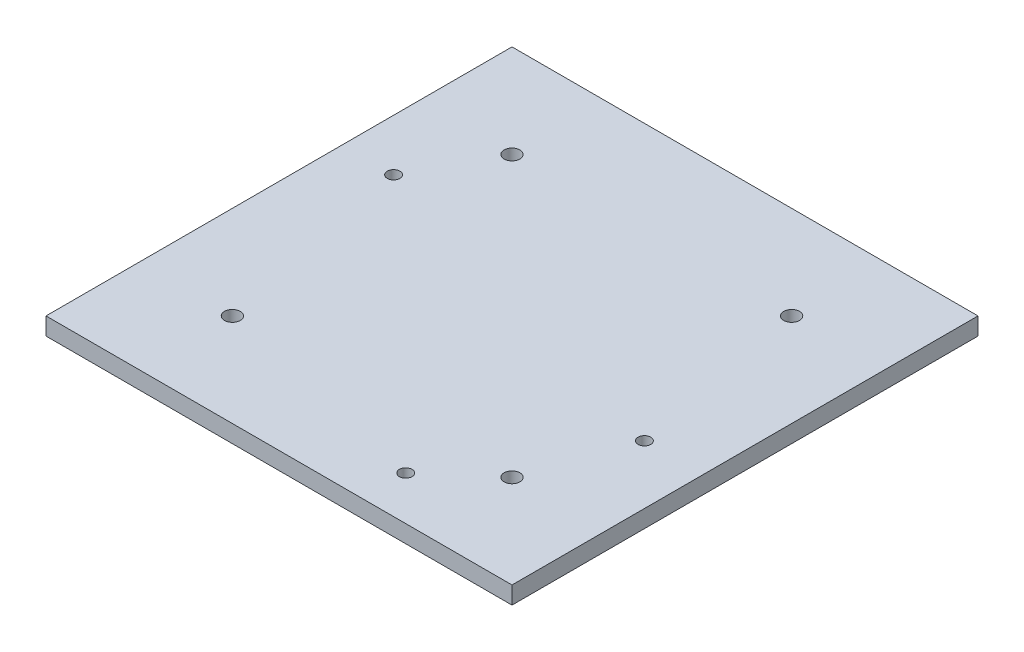
ISO-10303-21;
HEADER;
FILE_DESCRIPTION(('STEP AP214'),'2;1');
FILE_NAME('part.step','',(''),(''),'','','');
FILE_SCHEMA(('AUTOMOTIVE_DESIGN { 1 0 10303 214 1 1 1 1 }'));
ENDSEC;
DATA;
#1=APPLICATION_CONTEXT('core data for automotive mechanical design processes');
#2=APPLICATION_PROTOCOL_DEFINITION('international standard','automotive_design',2000,#1);
#3=PRODUCT_CONTEXT('',#1,'mechanical');
#4=PRODUCT('Part','Part','',(#3));
#5=PRODUCT_RELATED_PRODUCT_CATEGORY('part','',(#4));
#6=PRODUCT_DEFINITION_FORMATION('','',#4);
#7=PRODUCT_DEFINITION_CONTEXT('part definition',#1,'design');
#8=PRODUCT_DEFINITION('design','',#6,#7);
#9=PRODUCT_DEFINITION_SHAPE('','',#8);
#10=(LENGTH_UNIT() NAMED_UNIT(*) SI_UNIT(.MILLI.,.METRE.));
#11=(NAMED_UNIT(*) PLANE_ANGLE_UNIT() SI_UNIT($,.RADIAN.));
#12=(NAMED_UNIT(*) SI_UNIT($,.STERADIAN.) SOLID_ANGLE_UNIT());
#13=UNCERTAINTY_MEASURE_WITH_UNIT(LENGTH_MEASURE(1.E-05),#10,'distance_accuracy_value','');
#14=(GEOMETRIC_REPRESENTATION_CONTEXT(3) GLOBAL_UNCERTAINTY_ASSIGNED_CONTEXT((#13)) GLOBAL_UNIT_ASSIGNED_CONTEXT((#10,
#11,#12)) REPRESENTATION_CONTEXT('',''));
#15=CARTESIAN_POINT('',(0.,0.,0.));
#16=DIRECTION('',(0.,0.,1.));
#17=DIRECTION('',(1.,0.,0.));
#18=AXIS2_PLACEMENT_3D('',#15,#16,#17);
#19=CARTESIAN_POINT('',(0.,4.7625,0.));
#20=DIRECTION('',(0.,1.,0.));
#21=DIRECTION('',(0.,0.,1.));
#22=AXIS2_PLACEMENT_3D('',#19,#20,#21);
#23=PLANE('',#22);
#24=CARTESIAN_POINT('',(-80.9364921297783,4.7625,-54.7767676767677));
#25=DIRECTION('',(0.,-1.,0.));
#26=DIRECTION('',(0.,0.,-1.));
#27=AXIS2_PLACEMENT_3D('',#24,#25,#26);
#28=CIRCLE('',#27,2.15264999999999);
#29=CARTESIAN_POINT('',(-80.9364921297783,4.7625,-56.9294176767677));
#30=VERTEX_POINT('',#29);
#31=EDGE_CURVE('E130',#30,#30,#28,.T.);
#32=ORIENTED_EDGE('',*,*,#31,.T.);
#33=EDGE_LOOP('',(#32));
#34=FACE_BOUND('',#33,.T.);
#35=DIRECTION('',(0.,0.,-1.));
#36=VECTOR('',#35,1.);
#37=CARTESIAN_POINT('',(20.6635078702217,4.7625,-80.1767676767677));
#38=LINE('',#37,#36);
#39=CARTESIAN_POINT('',(20.6635078702217,4.7625,46.8232323232323));
#40=VERTEX_POINT('',#39);
#41=CARTESIAN_POINT('',(20.6635078702217,4.7625,-80.1767676767677));
#42=VERTEX_POINT('',#41);
#43=EDGE_CURVE('E92',#40,#42,#38,.T.);
#44=ORIENTED_EDGE('',*,*,#43,.T.);
#45=DIRECTION('',(-1.,0.,0.));
#46=VECTOR('',#45,1.);
#47=CARTESIAN_POINT('',(-106.336492129778,4.7625,-80.1767676767677));
#48=LINE('',#47,#46);
#49=CARTESIAN_POINT('',(-106.336492129778,4.7625,-80.1767676767677));
#50=VERTEX_POINT('',#49);
#51=EDGE_CURVE('E87',#42,#50,#48,.T.);
#52=ORIENTED_EDGE('',*,*,#51,.T.);
#53=DIRECTION('',(0.,0.,1.));
#54=VECTOR('',#53,1.);
#55=CARTESIAN_POINT('',(-106.336492129778,4.7625,-80.1767676767677));
#56=LINE('',#55,#54);
#57=CARTESIAN_POINT('',(-106.336492129778,4.7625,46.8232323232323));
#58=VERTEX_POINT('',#57);
#59=EDGE_CURVE('E90',#50,#58,#56,.T.);
#60=ORIENTED_EDGE('',*,*,#59,.T.);
#61=DIRECTION('',(1.,0.,0.));
#62=VECTOR('',#61,1.);
#63=CARTESIAN_POINT('',(-106.336492129778,4.7625,46.8232323232323));
#64=LINE('',#63,#62);
#65=EDGE_CURVE('E57',#58,#40,#64,.T.);
#66=ORIENTED_EDGE('',*,*,#65,.T.);
#67=EDGE_LOOP('',(#44,#52,#60,#66));
#68=FACE_BOUND('',#67,.T.);
#69=CARTESIAN_POINT('',(-92.2813444725521,4.7625,-33.8500482514238));
#70=DIRECTION('',(0.,1.,0.));
#71=DIRECTION('',(0.,0.,1.));
#72=AXIS2_PLACEMENT_3D('',#69,#70,#71);
#73=CIRCLE('',#72,1.7272);
#74=CARTESIAN_POINT('',(-92.2813444725521,4.7625,-32.1228482514238));
#75=VERTEX_POINT('',#74);
#76=EDGE_CURVE('E119',#75,#75,#73,.T.);
#77=ORIENTED_EDGE('',*,*,#76,.F.);
#78=EDGE_LOOP('',(#77));
#79=FACE_BOUND('',#78,.T.);
#80=CARTESIAN_POINT('',(-20.243685743917,4.7625,34.8839487871358));
#81=DIRECTION('',(0.,1.,0.));
#82=DIRECTION('',(0.,0.,1.));
#83=AXIS2_PLACEMENT_3D('',#80,#81,#82);
#84=CIRCLE('',#83,1.7272);
#85=CARTESIAN_POINT('',(-20.243685743917,4.7625,36.6111487871358));
#86=VERTEX_POINT('',#85);
#87=EDGE_CURVE('E161',#86,#86,#84,.T.);
#88=ORIENTED_EDGE('',*,*,#87,.F.);
#89=EDGE_LOOP('',(#88));
#90=FACE_BOUND('',#89,.T.);
#91=CARTESIAN_POINT('',(4.68077748384013,4.7625,-5.25040892303801));
#92=DIRECTION('',(0.,1.,0.));
#93=DIRECTION('',(0.,0.,1.));
#94=AXIS2_PLACEMENT_3D('',#91,#92,#93);
#95=CIRCLE('',#94,1.7272);
#96=CARTESIAN_POINT('',(4.68077748384013,4.7625,-3.52320892303801));
#97=VERTEX_POINT('',#96);
#98=EDGE_CURVE('E163',#97,#97,#95,.T.);
#99=ORIENTED_EDGE('',*,*,#98,.F.);
#100=EDGE_LOOP('',(#99));
#101=FACE_BOUND('',#100,.T.);
#102=CARTESIAN_POINT('',(-80.9364921297783,4.7625,21.4232323232323));
#103=DIRECTION('',(0.,-1.,0.));
#104=DIRECTION('',(0.,0.,-1.));
#105=AXIS2_PLACEMENT_3D('',#102,#103,#104);
#106=CIRCLE('',#105,2.15264999999999);
#107=CARTESIAN_POINT('',(-80.9364921297783,4.7625,19.2705823232323));
#108=VERTEX_POINT('',#107);
#109=EDGE_CURVE('E156',#108,#108,#106,.T.);
#110=ORIENTED_EDGE('',*,*,#109,.T.);
#111=EDGE_LOOP('',(#110));
#112=FACE_BOUND('',#111,.T.);
#113=CARTESIAN_POINT('',(-4.73649212977831,4.7625,-54.7767676767677));
#114=DIRECTION('',(0.,-1.,0.));
#115=DIRECTION('',(0.,0.,-1.));
#116=AXIS2_PLACEMENT_3D('',#113,#114,#115);
#117=CIRCLE('',#116,2.15265);
#118=CARTESIAN_POINT('',(-4.73649212977831,4.7625,-56.9294176767677));
#119=VERTEX_POINT('',#118);
#120=EDGE_CURVE('E147',#119,#119,#117,.T.);
#121=ORIENTED_EDGE('',*,*,#120,.T.);
#122=EDGE_LOOP('',(#121));
#123=FACE_BOUND('',#122,.T.);
#124=CARTESIAN_POINT('',(-4.73649212977831,4.7625,21.4232323232323));
#125=DIRECTION('',(0.,-1.,0.));
#126=DIRECTION('',(0.,0.,-1.));
#127=AXIS2_PLACEMENT_3D('',#124,#125,#126);
#128=CIRCLE('',#127,2.15265);
#129=CARTESIAN_POINT('',(-4.73649212977831,4.7625,19.2705823232323));
#130=VERTEX_POINT('',#129);
#131=EDGE_CURVE('E139',#130,#130,#128,.T.);
#132=ORIENTED_EDGE('',*,*,#131,.T.);
#133=EDGE_LOOP('',(#132));
#134=FACE_BOUND('',#133,.T.);
#135=ADVANCED_FACE('F40',(#34,#68,#79,#90,#101,#112,#123,#134),#23,.T.);
#136=CARTESIAN_POINT('',(20.6635078702217,4.7625,-80.1767676767677));
#137=DIRECTION('',(-1.,0.,0.));
#138=DIRECTION('',(0.,0.,1.));
#139=AXIS2_PLACEMENT_3D('',#136,#137,#138);
#140=PLANE('',#139);
#141=DIRECTION('',(0.,0.,-1.));
#142=VECTOR('',#141,1.);
#143=CARTESIAN_POINT('',(20.6635078702217,0.,-80.1767676767677));
#144=LINE('',#143,#142);
#145=CARTESIAN_POINT('',(20.6635078702217,0.,46.8232323232323));
#146=VERTEX_POINT('',#145);
#147=CARTESIAN_POINT('',(20.6635078702217,0.,-80.1767676767677));
#148=VERTEX_POINT('',#147);
#149=EDGE_CURVE('E218',#146,#148,#144,.T.);
#150=ORIENTED_EDGE('',*,*,#149,.T.);
#151=DIRECTION('',(0.,-1.,0.));
#152=VECTOR('',#151,1.);
#153=CARTESIAN_POINT('',(20.6635078702217,4.7625,-80.1767676767677));
#154=LINE('',#153,#152);
#155=EDGE_CURVE('E12',#42,#148,#154,.T.);
#156=ORIENTED_EDGE('',*,*,#155,.F.);
#157=ORIENTED_EDGE('',*,*,#43,.F.);
#158=DIRECTION('',(0.,-1.,0.));
#159=VECTOR('',#158,1.);
#160=CARTESIAN_POINT('',(20.6635078702217,4.7625,46.8232323232323));
#161=LINE('',#160,#159);
#162=EDGE_CURVE('E103',#40,#146,#161,.T.);
#163=ORIENTED_EDGE('',*,*,#162,.T.);
#164=EDGE_LOOP('',(#150,#156,#157,#163));
#165=FACE_BOUND('',#164,.T.);
#166=ADVANCED_FACE('F42',(#165),#140,.F.);
#167=CARTESIAN_POINT('',(-106.336492129778,4.7625,-80.1767676767677));
#168=DIRECTION('',(0.,0.,1.));
#169=DIRECTION('',(1.,0.,0.));
#170=AXIS2_PLACEMENT_3D('',#167,#168,#169);
#171=PLANE('',#170);
#172=DIRECTION('',(-1.,0.,0.));
#173=VECTOR('',#172,1.);
#174=CARTESIAN_POINT('',(-106.336492129778,0.,-80.1767676767677));
#175=LINE('',#174,#173);
#176=CARTESIAN_POINT('',(-106.336492129778,0.,-80.1767676767677));
#177=VERTEX_POINT('',#176);
#178=EDGE_CURVE('E97',#148,#177,#175,.T.);
#179=ORIENTED_EDGE('',*,*,#178,.T.);
#180=DIRECTION('',(0.,-1.,0.));
#181=VECTOR('',#180,1.);
#182=CARTESIAN_POINT('',(-106.336492129778,4.7625,-80.1767676767677));
#183=LINE('',#182,#181);
#184=EDGE_CURVE('E49',#50,#177,#183,.T.);
#185=ORIENTED_EDGE('',*,*,#184,.F.);
#186=ORIENTED_EDGE('',*,*,#51,.F.);
#187=ORIENTED_EDGE('',*,*,#155,.T.);
#188=EDGE_LOOP('',(#179,#185,#186,#187));
#189=FACE_BOUND('',#188,.T.);
#190=ADVANCED_FACE('F96',(#189),#171,.F.);
#191=CARTESIAN_POINT('',(-106.336492129778,4.7625,-80.1767676767677));
#192=DIRECTION('',(1.,0.,0.));
#193=DIRECTION('',(0.,0.,-1.));
#194=AXIS2_PLACEMENT_3D('',#191,#192,#193);
#195=PLANE('',#194);
#196=DIRECTION('',(0.,0.,1.));
#197=VECTOR('',#196,1.);
#198=CARTESIAN_POINT('',(-106.336492129778,0.,-80.1767676767677));
#199=LINE('',#198,#197);
#200=CARTESIAN_POINT('',(-106.336492129778,0.,46.8232323232323));
#201=VERTEX_POINT('',#200);
#202=EDGE_CURVE('E74',#177,#201,#199,.T.);
#203=ORIENTED_EDGE('',*,*,#202,.T.);
#204=DIRECTION('',(0.,-1.,0.));
#205=VECTOR('',#204,1.);
#206=CARTESIAN_POINT('',(-106.336492129778,4.7625,46.8232323232323));
#207=LINE('',#206,#205);
#208=EDGE_CURVE('E98',#58,#201,#207,.T.);
#209=ORIENTED_EDGE('',*,*,#208,.F.);
#210=ORIENTED_EDGE('',*,*,#59,.F.);
#211=ORIENTED_EDGE('',*,*,#184,.T.);
#212=EDGE_LOOP('',(#203,#209,#210,#211));
#213=FACE_BOUND('',#212,.T.);
#214=ADVANCED_FACE('F99',(#213),#195,.F.);
#215=CARTESIAN_POINT('',(-106.336492129778,4.7625,46.8232323232323));
#216=DIRECTION('',(0.,0.,-1.));
#217=DIRECTION('',(-1.,0.,0.));
#218=AXIS2_PLACEMENT_3D('',#215,#216,#217);
#219=PLANE('',#218);
#220=DIRECTION('',(1.,0.,0.));
#221=VECTOR('',#220,1.);
#222=CARTESIAN_POINT('',(-106.336492129778,0.,46.8232323232323));
#223=LINE('',#222,#221);
#224=EDGE_CURVE('E80',#201,#146,#223,.T.);
#225=ORIENTED_EDGE('',*,*,#224,.T.);
#226=ORIENTED_EDGE('',*,*,#162,.F.);
#227=ORIENTED_EDGE('',*,*,#65,.F.);
#228=ORIENTED_EDGE('',*,*,#208,.T.);
#229=EDGE_LOOP('',(#225,#226,#227,#228));
#230=FACE_BOUND('',#229,.T.);
#231=ADVANCED_FACE('F201',(#230),#219,.F.);
#232=CARTESIAN_POINT('',(0.,0.,0.));
#233=DIRECTION('',(0.,1.,0.));
#234=DIRECTION('',(0.,0.,1.));
#235=AXIS2_PLACEMENT_3D('',#232,#233,#234);
#236=PLANE('',#235);
#237=CARTESIAN_POINT('',(-80.9364921297783,0.,-54.7767676767677));
#238=DIRECTION('',(0.,-1.,0.));
#239=DIRECTION('',(0.,0.,-1.));
#240=AXIS2_PLACEMENT_3D('',#237,#238,#239);
#241=CIRCLE('',#240,2.15265000000001);
#242=CARTESIAN_POINT('',(-80.9364921297783,0.,-56.9294176767677));
#243=VERTEX_POINT('',#242);
#244=EDGE_CURVE('E137',#243,#243,#241,.T.);
#245=ORIENTED_EDGE('',*,*,#244,.F.);
#246=EDGE_LOOP('',(#245));
#247=FACE_BOUND('',#246,.T.);
#248=CARTESIAN_POINT('',(-4.73649212977831,0.,21.4232323232323));
#249=DIRECTION('',(0.,-1.,0.));
#250=DIRECTION('',(0.,0.,-1.));
#251=AXIS2_PLACEMENT_3D('',#248,#249,#250);
#252=CIRCLE('',#251,2.15265);
#253=CARTESIAN_POINT('',(-4.73649212977831,0.,19.2705823232323));
#254=VERTEX_POINT('',#253);
#255=EDGE_CURVE('E136',#254,#254,#252,.T.);
#256=ORIENTED_EDGE('',*,*,#255,.F.);
#257=EDGE_LOOP('',(#256));
#258=FACE_BOUND('',#257,.T.);
#259=CARTESIAN_POINT('',(-4.73649212977831,0.,-54.7767676767677));
#260=DIRECTION('',(0.,-1.,0.));
#261=DIRECTION('',(0.,0.,-1.));
#262=AXIS2_PLACEMENT_3D('',#259,#260,#261);
#263=CIRCLE('',#262,2.15265);
#264=CARTESIAN_POINT('',(-4.73649212977831,0.,-56.9294176767677));
#265=VERTEX_POINT('',#264);
#266=EDGE_CURVE('E144',#265,#265,#263,.T.);
#267=ORIENTED_EDGE('',*,*,#266,.F.);
#268=EDGE_LOOP('',(#267));
#269=FACE_BOUND('',#268,.T.);
#270=CARTESIAN_POINT('',(-80.9364921297783,0.,21.4232323232323));
#271=DIRECTION('',(0.,-1.,0.));
#272=DIRECTION('',(0.,0.,-1.));
#273=AXIS2_PLACEMENT_3D('',#270,#271,#272);
#274=CIRCLE('',#273,2.15265000000001);
#275=CARTESIAN_POINT('',(-80.9364921297783,0.,19.2705823232323));
#276=VERTEX_POINT('',#275);
#277=EDGE_CURVE('E152',#276,#276,#274,.T.);
#278=ORIENTED_EDGE('',*,*,#277,.F.);
#279=EDGE_LOOP('',(#278));
#280=FACE_BOUND('',#279,.T.);
#281=CARTESIAN_POINT('',(4.68077748384013,0.,-5.25040892303801));
#282=DIRECTION('',(0.,1.,0.));
#283=DIRECTION('',(0.,0.,1.));
#284=AXIS2_PLACEMENT_3D('',#281,#282,#283);
#285=CIRCLE('',#284,1.7272);
#286=CARTESIAN_POINT('',(4.68077748384013,0.,-3.52320892303801));
#287=VERTEX_POINT('',#286);
#288=EDGE_CURVE('E125',#287,#287,#285,.T.);
#289=ORIENTED_EDGE('',*,*,#288,.T.);
#290=EDGE_LOOP('',(#289));
#291=FACE_BOUND('',#290,.T.);
#292=CARTESIAN_POINT('',(-20.243685743917,0.,34.8839487871358));
#293=DIRECTION('',(0.,1.,0.));
#294=DIRECTION('',(0.,0.,1.));
#295=AXIS2_PLACEMENT_3D('',#292,#293,#294);
#296=CIRCLE('',#295,1.7272);
#297=CARTESIAN_POINT('',(-20.243685743917,0.,36.6111487871358));
#298=VERTEX_POINT('',#297);
#299=EDGE_CURVE('E168',#298,#298,#296,.T.);
#300=ORIENTED_EDGE('',*,*,#299,.T.);
#301=EDGE_LOOP('',(#300));
#302=FACE_BOUND('',#301,.T.);
#303=CARTESIAN_POINT('',(-92.2813444725521,0.,-33.8500482514238));
#304=DIRECTION('',(0.,1.,0.));
#305=DIRECTION('',(0.,0.,1.));
#306=AXIS2_PLACEMENT_3D('',#303,#304,#305);
#307=CIRCLE('',#306,1.7272);
#308=CARTESIAN_POINT('',(-92.2813444725521,0.,-32.1228482514238));
#309=VERTEX_POINT('',#308);
#310=EDGE_CURVE('E124',#309,#309,#307,.T.);
#311=ORIENTED_EDGE('',*,*,#310,.T.);
#312=EDGE_LOOP('',(#311));
#313=FACE_BOUND('',#312,.T.);
#314=ORIENTED_EDGE('',*,*,#149,.F.);
#315=ORIENTED_EDGE('',*,*,#224,.F.);
#316=ORIENTED_EDGE('',*,*,#202,.F.);
#317=ORIENTED_EDGE('',*,*,#178,.F.);
#318=EDGE_LOOP('',(#314,#315,#316,#317));
#319=FACE_BOUND('',#318,.T.);
#320=ADVANCED_FACE('F197',(#247,#258,#269,#280,#291,#302,#313,#319),#236,.F.);
#321=CARTESIAN_POINT('',(-92.2813444725521,0.,-33.8500482514238));
#322=DIRECTION('',(0.,1.,0.));
#323=DIRECTION('',(0.,0.,1.));
#324=AXIS2_PLACEMENT_3D('',#321,#322,#323);
#325=CYLINDRICAL_SURFACE('',#324,1.7272);
#326=CARTESIAN_POINT('',(-92.2813444725521,0.,-32.1228482514238));
#327=CARTESIAN_POINT('',(-92.2813444725521,0.049609375,-32.1228482514238));
#328=CARTESIAN_POINT('',(-92.2813444725521,0.09921875,-32.1228482514238));
#329=CARTESIAN_POINT('',(-92.2813444725521,0.1984375,-32.1228482514238));
#330=CARTESIAN_POINT('',(-92.2813444725521,0.248046875,-32.1228482514238));
#331=CARTESIAN_POINT('',(-92.2813444725521,0.347265625,-32.1228482514238));
#332=CARTESIAN_POINT('',(-92.2813444725521,0.396875,-32.1228482514238));
#333=CARTESIAN_POINT('',(-92.2813444725521,0.49609375,-32.1228482514238));
#334=CARTESIAN_POINT('',(-92.2813444725521,0.545703125,-32.1228482514238));
#335=CARTESIAN_POINT('',(-92.2813444725521,0.644921875,-32.1228482514238));
#336=CARTESIAN_POINT('',(-92.2813444725521,0.69453125,-32.1228482514238));
#337=CARTESIAN_POINT('',(-92.2813444725521,0.79375,-32.1228482514238));
#338=CARTESIAN_POINT('',(-92.2813444725521,0.843359375,-32.1228482514238));
#339=CARTESIAN_POINT('',(-92.2813444725521,0.942578125,-32.1228482514238));
#340=CARTESIAN_POINT('',(-92.2813444725521,0.9921875,-32.1228482514238));
#341=CARTESIAN_POINT('',(-92.2813444725521,1.09140625,-32.1228482514238));
#342=CARTESIAN_POINT('',(-92.2813444725521,1.141015625,-32.1228482514238));
#343=CARTESIAN_POINT('',(-92.2813444725521,1.240234375,-32.1228482514238));
#344=CARTESIAN_POINT('',(-92.2813444725521,1.28984375,-32.1228482514238));
#345=CARTESIAN_POINT('',(-92.2813444725521,1.3890625,-32.1228482514238));
#346=CARTESIAN_POINT('',(-92.2813444725521,1.438671875,-32.1228482514238));
#347=CARTESIAN_POINT('',(-92.2813444725521,1.537890625,-32.1228482514238));
#348=CARTESIAN_POINT('',(-92.2813444725521,1.5875,-32.1228482514238));
#349=CARTESIAN_POINT('',(-92.2813444725521,1.68671875,-32.1228482514238));
#350=CARTESIAN_POINT('',(-92.2813444725521,1.736328125,-32.1228482514238));
#351=CARTESIAN_POINT('',(-92.2813444725521,1.835546875,-32.1228482514238));
#352=CARTESIAN_POINT('',(-92.2813444725521,1.88515625,-32.1228482514238));
#353=CARTESIAN_POINT('',(-92.2813444725521,1.984375,-32.1228482514238));
#354=CARTESIAN_POINT('',(-92.2813444725521,2.033984375,-32.1228482514238));
#355=CARTESIAN_POINT('',(-92.2813444725521,2.133203125,-32.1228482514238));
#356=CARTESIAN_POINT('',(-92.2813444725521,2.1828125,-32.1228482514238));
#357=CARTESIAN_POINT('',(-92.2813444725521,2.28203125,-32.1228482514238));
#358=CARTESIAN_POINT('',(-92.2813444725521,2.331640625,-32.1228482514238));
#359=CARTESIAN_POINT('',(-92.2813444725521,2.430859375,-32.1228482514238));
#360=CARTESIAN_POINT('',(-92.2813444725521,2.48046875,-32.1228482514238));
#361=CARTESIAN_POINT('',(-92.2813444725521,2.5796875,-32.1228482514238));
#362=CARTESIAN_POINT('',(-92.2813444725521,2.629296875,-32.1228482514238));
#363=CARTESIAN_POINT('',(-92.2813444725521,2.728515625,-32.1228482514238));
#364=CARTESIAN_POINT('',(-92.2813444725521,2.778125,-32.1228482514238));
#365=CARTESIAN_POINT('',(-92.2813444725521,2.87734375,-32.1228482514238));
#366=CARTESIAN_POINT('',(-92.2813444725521,2.926953125,-32.1228482514238));
#367=CARTESIAN_POINT('',(-92.2813444725521,3.026171875,-32.1228482514238));
#368=CARTESIAN_POINT('',(-92.2813444725521,3.07578125,-32.1228482514238));
#369=CARTESIAN_POINT('',(-92.2813444725521,3.175,-32.1228482514238));
#370=CARTESIAN_POINT('',(-92.2813444725521,3.224609375,-32.1228482514238));
#371=CARTESIAN_POINT('',(-92.2813444725521,3.323828125,-32.1228482514238));
#372=CARTESIAN_POINT('',(-92.2813444725521,3.3734375,-32.1228482514238));
#373=CARTESIAN_POINT('',(-92.2813444725521,3.47265625,-32.1228482514238));
#374=CARTESIAN_POINT('',(-92.2813444725521,3.522265625,-32.1228482514238));
#375=CARTESIAN_POINT('',(-92.2813444725521,3.621484375,-32.1228482514238));
#376=CARTESIAN_POINT('',(-92.2813444725521,3.67109375,-32.1228482514238));
#377=CARTESIAN_POINT('',(-92.2813444725521,3.7703125,-32.1228482514238));
#378=CARTESIAN_POINT('',(-92.2813444725521,3.819921875,-32.1228482514238));
#379=CARTESIAN_POINT('',(-92.2813444725521,3.919140625,-32.1228482514238));
#380=CARTESIAN_POINT('',(-92.2813444725521,3.96875,-32.1228482514238));
#381=CARTESIAN_POINT('',(-92.2813444725521,4.06796875,-32.1228482514238));
#382=CARTESIAN_POINT('',(-92.2813444725521,4.117578125,-32.1228482514238));
#383=CARTESIAN_POINT('',(-92.2813444725521,4.216796875,-32.1228482514238));
#384=CARTESIAN_POINT('',(-92.2813444725521,4.26640625,-32.1228482514238));
#385=CARTESIAN_POINT('',(-92.2813444725521,4.365625,-32.1228482514238));
#386=CARTESIAN_POINT('',(-92.2813444725521,4.415234375,-32.1228482514238));
#387=CARTESIAN_POINT('',(-92.2813444725521,4.514453125,-32.1228482514238));
#388=CARTESIAN_POINT('',(-92.2813444725521,4.5640625,-32.1228482514238));
#389=CARTESIAN_POINT('',(-92.2813444725521,4.66328125,-32.1228482514238));
#390=CARTESIAN_POINT('',(-92.2813444725521,4.712890625,-32.1228482514238));
#391=CARTESIAN_POINT('',(-92.2813444725521,4.7625,-32.1228482514238));
#392=B_SPLINE_CURVE_WITH_KNOTS('',3,(#326,#327,#328,#329,#330,#331,#332,#333,#334,#335,#336,
#337,#338,#339,#340,#341,#342,#343,#344,#345,#346,#347,#348,#349,#350,#351,#352,#353,#354,#355,
#356,#357,#358,#359,#360,#361,#362,#363,#364,#365,#366,#367,#368,#369,#370,#371,#372,#373,#374,
#375,#376,#377,#378,#379,#380,#381,#382,#383,#384,#385,#386,#387,#388,#389,#390,#391),
.UNSPECIFIED.,.F.,.F.,(4,2,2,2,2,2,2,2,2,2,2,2,2,2,2,2,2,2,2,2,2,2,2,2,2,2,2,2,2,2,2,2,4),(0.,
0.148828125,0.29765625,0.446484375,0.5953125,0.744140625,0.89296875,1.041796875,1.190625,
1.339453125,1.48828125,1.637109375,1.7859375,1.934765625,2.08359375,2.232421875,2.38125,
2.530078125,2.67890625,2.827734375,2.9765625,3.125390625,3.27421875,3.423046875,3.571875,
3.720703125,3.86953125,4.018359375,4.1671875,4.316015625,4.46484375,4.613671875,4.7625),.UNSPECIFIED.);
#393=EDGE_CURVE('BSEAM200',#309,#75,#392,.T.);
#394=ORIENTED_EDGE('',*,*,#310,.F.);
#395=ORIENTED_EDGE('',*,*,#76,.T.);
#396=ORIENTED_EDGE('',*,*,#393,.T.);
#397=ORIENTED_EDGE('',*,*,#393,.F.);
#398=EDGE_LOOP('',(#394,#396,#395,#397));
#399=FACE_BOUND('',#398,.T.);
#400=ADVANCED_FACE('F200',(#399),#325,.F.);
#401=CARTESIAN_POINT('',(-20.243685743917,0.,34.8839487871358));
#402=DIRECTION('',(0.,1.,0.));
#403=DIRECTION('',(0.,0.,1.));
#404=AXIS2_PLACEMENT_3D('',#401,#402,#403);
#405=CYLINDRICAL_SURFACE('',#404,1.7272);
#406=CARTESIAN_POINT('',(-20.243685743917,0.,36.6111487871358));
#407=CARTESIAN_POINT('',(-20.243685743917,0.049609375,36.6111487871358));
#408=CARTESIAN_POINT('',(-20.243685743917,0.09921875,36.6111487871358));
#409=CARTESIAN_POINT('',(-20.243685743917,0.1984375,36.6111487871358));
#410=CARTESIAN_POINT('',(-20.243685743917,0.248046875,36.6111487871358));
#411=CARTESIAN_POINT('',(-20.243685743917,0.347265625,36.6111487871358));
#412=CARTESIAN_POINT('',(-20.243685743917,0.396875,36.6111487871358));
#413=CARTESIAN_POINT('',(-20.243685743917,0.49609375,36.6111487871358));
#414=CARTESIAN_POINT('',(-20.243685743917,0.545703125,36.6111487871358));
#415=CARTESIAN_POINT('',(-20.243685743917,0.644921875,36.6111487871358));
#416=CARTESIAN_POINT('',(-20.243685743917,0.69453125,36.6111487871358));
#417=CARTESIAN_POINT('',(-20.243685743917,0.79375,36.6111487871358));
#418=CARTESIAN_POINT('',(-20.243685743917,0.843359375,36.6111487871358));
#419=CARTESIAN_POINT('',(-20.243685743917,0.942578125,36.6111487871358));
#420=CARTESIAN_POINT('',(-20.243685743917,0.9921875,36.6111487871358));
#421=CARTESIAN_POINT('',(-20.243685743917,1.09140625,36.6111487871358));
#422=CARTESIAN_POINT('',(-20.243685743917,1.141015625,36.6111487871358));
#423=CARTESIAN_POINT('',(-20.243685743917,1.240234375,36.6111487871358));
#424=CARTESIAN_POINT('',(-20.243685743917,1.28984375,36.6111487871358));
#425=CARTESIAN_POINT('',(-20.243685743917,1.3890625,36.6111487871358));
#426=CARTESIAN_POINT('',(-20.243685743917,1.438671875,36.6111487871358));
#427=CARTESIAN_POINT('',(-20.243685743917,1.537890625,36.6111487871358));
#428=CARTESIAN_POINT('',(-20.243685743917,1.5875,36.6111487871358));
#429=CARTESIAN_POINT('',(-20.243685743917,1.68671875,36.6111487871358));
#430=CARTESIAN_POINT('',(-20.243685743917,1.736328125,36.6111487871358));
#431=CARTESIAN_POINT('',(-20.243685743917,1.835546875,36.6111487871358));
#432=CARTESIAN_POINT('',(-20.243685743917,1.88515625,36.6111487871358));
#433=CARTESIAN_POINT('',(-20.243685743917,1.984375,36.6111487871358));
#434=CARTESIAN_POINT('',(-20.243685743917,2.033984375,36.6111487871358));
#435=CARTESIAN_POINT('',(-20.243685743917,2.133203125,36.6111487871358));
#436=CARTESIAN_POINT('',(-20.243685743917,2.1828125,36.6111487871358));
#437=CARTESIAN_POINT('',(-20.243685743917,2.28203125,36.6111487871358));
#438=CARTESIAN_POINT('',(-20.243685743917,2.331640625,36.6111487871358));
#439=CARTESIAN_POINT('',(-20.243685743917,2.430859375,36.6111487871358));
#440=CARTESIAN_POINT('',(-20.243685743917,2.48046875,36.6111487871358));
#441=CARTESIAN_POINT('',(-20.243685743917,2.5796875,36.6111487871358));
#442=CARTESIAN_POINT('',(-20.243685743917,2.629296875,36.6111487871358));
#443=CARTESIAN_POINT('',(-20.243685743917,2.728515625,36.6111487871358));
#444=CARTESIAN_POINT('',(-20.243685743917,2.778125,36.6111487871358));
#445=CARTESIAN_POINT('',(-20.243685743917,2.87734375,36.6111487871358));
#446=CARTESIAN_POINT('',(-20.243685743917,2.926953125,36.6111487871358));
#447=CARTESIAN_POINT('',(-20.243685743917,3.026171875,36.6111487871358));
#448=CARTESIAN_POINT('',(-20.243685743917,3.07578125,36.6111487871358));
#449=CARTESIAN_POINT('',(-20.243685743917,3.175,36.6111487871358));
#450=CARTESIAN_POINT('',(-20.243685743917,3.224609375,36.6111487871358));
#451=CARTESIAN_POINT('',(-20.243685743917,3.323828125,36.6111487871358));
#452=CARTESIAN_POINT('',(-20.243685743917,3.3734375,36.6111487871358));
#453=CARTESIAN_POINT('',(-20.243685743917,3.47265625,36.6111487871358));
#454=CARTESIAN_POINT('',(-20.243685743917,3.522265625,36.6111487871358));
#455=CARTESIAN_POINT('',(-20.243685743917,3.621484375,36.6111487871358));
#456=CARTESIAN_POINT('',(-20.243685743917,3.67109375,36.6111487871358));
#457=CARTESIAN_POINT('',(-20.243685743917,3.7703125,36.6111487871358));
#458=CARTESIAN_POINT('',(-20.243685743917,3.819921875,36.6111487871358));
#459=CARTESIAN_POINT('',(-20.243685743917,3.919140625,36.6111487871358));
#460=CARTESIAN_POINT('',(-20.243685743917,3.96875,36.6111487871358));
#461=CARTESIAN_POINT('',(-20.243685743917,4.06796875,36.6111487871358));
#462=CARTESIAN_POINT('',(-20.243685743917,4.117578125,36.6111487871358));
#463=CARTESIAN_POINT('',(-20.243685743917,4.216796875,36.6111487871358));
#464=CARTESIAN_POINT('',(-20.243685743917,4.26640625,36.6111487871358));
#465=CARTESIAN_POINT('',(-20.243685743917,4.365625,36.6111487871358));
#466=CARTESIAN_POINT('',(-20.243685743917,4.415234375,36.6111487871358));
#467=CARTESIAN_POINT('',(-20.243685743917,4.514453125,36.6111487871358));
#468=CARTESIAN_POINT('',(-20.243685743917,4.5640625,36.6111487871358));
#469=CARTESIAN_POINT('',(-20.243685743917,4.66328125,36.6111487871358));
#470=CARTESIAN_POINT('',(-20.243685743917,4.712890625,36.6111487871358));
#471=CARTESIAN_POINT('',(-20.243685743917,4.7625,36.6111487871358));
#472=B_SPLINE_CURVE_WITH_KNOTS('',3,(#406,#407,#408,#409,#410,#411,#412,#413,#414,#415,#416,
#417,#418,#419,#420,#421,#422,#423,#424,#425,#426,#427,#428,#429,#430,#431,#432,#433,#434,#435,
#436,#437,#438,#439,#440,#441,#442,#443,#444,#445,#446,#447,#448,#449,#450,#451,#452,#453,#454,
#455,#456,#457,#458,#459,#460,#461,#462,#463,#464,#465,#466,#467,#468,#469,#470,#471),
.UNSPECIFIED.,.F.,.F.,(4,2,2,2,2,2,2,2,2,2,2,2,2,2,2,2,2,2,2,2,2,2,2,2,2,2,2,2,2,2,2,2,4),(0.,
0.148828125,0.29765625,0.446484375,0.5953125,0.744140625,0.89296875,1.041796875,1.190625,
1.339453125,1.48828125,1.637109375,1.7859375,1.934765625,2.08359375,2.232421875,2.38125,
2.530078125,2.67890625,2.827734375,2.9765625,3.125390625,3.27421875,3.423046875,3.571875,
3.720703125,3.86953125,4.018359375,4.1671875,4.316015625,4.46484375,4.613671875,4.7625),.UNSPECIFIED.);
#473=EDGE_CURVE('BSEAM175',#298,#86,#472,.T.);
#474=ORIENTED_EDGE('',*,*,#299,.F.);
#475=ORIENTED_EDGE('',*,*,#87,.T.);
#476=ORIENTED_EDGE('',*,*,#473,.T.);
#477=ORIENTED_EDGE('',*,*,#473,.F.);
#478=EDGE_LOOP('',(#474,#476,#475,#477));
#479=FACE_BOUND('',#478,.T.);
#480=ADVANCED_FACE('F175',(#479),#405,.F.);
#481=CARTESIAN_POINT('',(4.68077748384013,0.,-5.25040892303801));
#482=DIRECTION('',(0.,1.,0.));
#483=DIRECTION('',(0.,0.,1.));
#484=AXIS2_PLACEMENT_3D('',#481,#482,#483);
#485=CYLINDRICAL_SURFACE('',#484,1.7272);
#486=CARTESIAN_POINT('',(4.68077748384013,0.,-3.52320892303801));
#487=CARTESIAN_POINT('',(4.68077748384013,0.049609375,-3.52320892303801));
#488=CARTESIAN_POINT('',(4.68077748384013,0.09921875,-3.52320892303801));
#489=CARTESIAN_POINT('',(4.68077748384013,0.1984375,-3.52320892303801));
#490=CARTESIAN_POINT('',(4.68077748384013,0.248046875,-3.52320892303801));
#491=CARTESIAN_POINT('',(4.68077748384013,0.347265625,-3.52320892303801));
#492=CARTESIAN_POINT('',(4.68077748384013,0.396875,-3.52320892303801));
#493=CARTESIAN_POINT('',(4.68077748384013,0.49609375,-3.52320892303801));
#494=CARTESIAN_POINT('',(4.68077748384013,0.545703125,-3.52320892303801));
#495=CARTESIAN_POINT('',(4.68077748384013,0.644921875,-3.52320892303801));
#496=CARTESIAN_POINT('',(4.68077748384013,0.69453125,-3.52320892303801));
#497=CARTESIAN_POINT('',(4.68077748384013,0.79375,-3.52320892303801));
#498=CARTESIAN_POINT('',(4.68077748384013,0.843359375,-3.52320892303801));
#499=CARTESIAN_POINT('',(4.68077748384013,0.942578125,-3.52320892303801));
#500=CARTESIAN_POINT('',(4.68077748384013,0.9921875,-3.52320892303801));
#501=CARTESIAN_POINT('',(4.68077748384013,1.09140625,-3.52320892303801));
#502=CARTESIAN_POINT('',(4.68077748384013,1.141015625,-3.52320892303801));
#503=CARTESIAN_POINT('',(4.68077748384013,1.240234375,-3.52320892303801));
#504=CARTESIAN_POINT('',(4.68077748384013,1.28984375,-3.52320892303801));
#505=CARTESIAN_POINT('',(4.68077748384013,1.3890625,-3.52320892303801));
#506=CARTESIAN_POINT('',(4.68077748384013,1.438671875,-3.52320892303801));
#507=CARTESIAN_POINT('',(4.68077748384013,1.537890625,-3.52320892303801));
#508=CARTESIAN_POINT('',(4.68077748384013,1.5875,-3.52320892303801));
#509=CARTESIAN_POINT('',(4.68077748384013,1.68671875,-3.52320892303801));
#510=CARTESIAN_POINT('',(4.68077748384013,1.736328125,-3.52320892303801));
#511=CARTESIAN_POINT('',(4.68077748384013,1.835546875,-3.52320892303801));
#512=CARTESIAN_POINT('',(4.68077748384013,1.88515625,-3.52320892303801));
#513=CARTESIAN_POINT('',(4.68077748384013,1.984375,-3.52320892303801));
#514=CARTESIAN_POINT('',(4.68077748384013,2.033984375,-3.52320892303801));
#515=CARTESIAN_POINT('',(4.68077748384013,2.133203125,-3.52320892303801));
#516=CARTESIAN_POINT('',(4.68077748384013,2.1828125,-3.52320892303801));
#517=CARTESIAN_POINT('',(4.68077748384013,2.28203125,-3.52320892303801));
#518=CARTESIAN_POINT('',(4.68077748384013,2.331640625,-3.52320892303801));
#519=CARTESIAN_POINT('',(4.68077748384013,2.430859375,-3.52320892303801));
#520=CARTESIAN_POINT('',(4.68077748384013,2.48046875,-3.52320892303801));
#521=CARTESIAN_POINT('',(4.68077748384013,2.5796875,-3.52320892303801));
#522=CARTESIAN_POINT('',(4.68077748384013,2.629296875,-3.52320892303801));
#523=CARTESIAN_POINT('',(4.68077748384013,2.728515625,-3.52320892303801));
#524=CARTESIAN_POINT('',(4.68077748384013,2.778125,-3.52320892303801));
#525=CARTESIAN_POINT('',(4.68077748384013,2.87734375,-3.52320892303801));
#526=CARTESIAN_POINT('',(4.68077748384013,2.926953125,-3.52320892303801));
#527=CARTESIAN_POINT('',(4.68077748384013,3.026171875,-3.52320892303801));
#528=CARTESIAN_POINT('',(4.68077748384013,3.07578125,-3.52320892303801));
#529=CARTESIAN_POINT('',(4.68077748384013,3.175,-3.52320892303801));
#530=CARTESIAN_POINT('',(4.68077748384013,3.224609375,-3.52320892303801));
#531=CARTESIAN_POINT('',(4.68077748384013,3.323828125,-3.52320892303801));
#532=CARTESIAN_POINT('',(4.68077748384013,3.3734375,-3.52320892303801));
#533=CARTESIAN_POINT('',(4.68077748384013,3.47265625,-3.52320892303801));
#534=CARTESIAN_POINT('',(4.68077748384013,3.522265625,-3.52320892303801));
#535=CARTESIAN_POINT('',(4.68077748384013,3.621484375,-3.52320892303801));
#536=CARTESIAN_POINT('',(4.68077748384013,3.67109375,-3.52320892303801));
#537=CARTESIAN_POINT('',(4.68077748384013,3.7703125,-3.52320892303801));
#538=CARTESIAN_POINT('',(4.68077748384013,3.819921875,-3.52320892303801));
#539=CARTESIAN_POINT('',(4.68077748384013,3.919140625,-3.52320892303801));
#540=CARTESIAN_POINT('',(4.68077748384013,3.96875,-3.52320892303801));
#541=CARTESIAN_POINT('',(4.68077748384013,4.06796875,-3.52320892303801));
#542=CARTESIAN_POINT('',(4.68077748384013,4.117578125,-3.52320892303801));
#543=CARTESIAN_POINT('',(4.68077748384013,4.216796875,-3.52320892303801));
#544=CARTESIAN_POINT('',(4.68077748384013,4.26640625,-3.52320892303801));
#545=CARTESIAN_POINT('',(4.68077748384013,4.365625,-3.52320892303801));
#546=CARTESIAN_POINT('',(4.68077748384013,4.415234375,-3.52320892303801));
#547=CARTESIAN_POINT('',(4.68077748384013,4.514453125,-3.52320892303801));
#548=CARTESIAN_POINT('',(4.68077748384013,4.5640625,-3.52320892303801));
#549=CARTESIAN_POINT('',(4.68077748384013,4.66328125,-3.52320892303801));
#550=CARTESIAN_POINT('',(4.68077748384013,4.712890625,-3.52320892303801));
#551=CARTESIAN_POINT('',(4.68077748384013,4.7625,-3.52320892303801));
#552=B_SPLINE_CURVE_WITH_KNOTS('',3,(#486,#487,#488,#489,#490,#491,#492,#493,#494,#495,#496,
#497,#498,#499,#500,#501,#502,#503,#504,#505,#506,#507,#508,#509,#510,#511,#512,#513,#514,#515,
#516,#517,#518,#519,#520,#521,#522,#523,#524,#525,#526,#527,#528,#529,#530,#531,#532,#533,#534,
#535,#536,#537,#538,#539,#540,#541,#542,#543,#544,#545,#546,#547,#548,#549,#550,#551),
.UNSPECIFIED.,.F.,.F.,(4,2,2,2,2,2,2,2,2,2,2,2,2,2,2,2,2,2,2,2,2,2,2,2,2,2,2,2,2,2,2,2,4),(0.,
0.148828125,0.29765625,0.446484375,0.5953125,0.744140625,0.89296875,1.041796875,1.190625,
1.339453125,1.48828125,1.637109375,1.7859375,1.934765625,2.08359375,2.232421875,2.38125,
2.530078125,2.67890625,2.827734375,2.9765625,3.125390625,3.27421875,3.423046875,3.571875,
3.720703125,3.86953125,4.018359375,4.1671875,4.316015625,4.46484375,4.613671875,4.7625),.UNSPECIFIED.);
#553=EDGE_CURVE('BSEAM241',#287,#97,#552,.T.);
#554=ORIENTED_EDGE('',*,*,#288,.F.);
#555=ORIENTED_EDGE('',*,*,#98,.T.);
#556=ORIENTED_EDGE('',*,*,#553,.T.);
#557=ORIENTED_EDGE('',*,*,#553,.F.);
#558=EDGE_LOOP('',(#554,#556,#555,#557));
#559=FACE_BOUND('',#558,.T.);
#560=ADVANCED_FACE('F241',(#559),#485,.F.);
#561=CARTESIAN_POINT('',(-80.9364921297783,0.,21.4232323232323));
#562=DIRECTION('',(0.,-1.,0.));
#563=DIRECTION('',(0.,0.,-1.));
#564=AXIS2_PLACEMENT_3D('',#561,#562,#563);
#565=CYLINDRICAL_SURFACE('',#564,2.15265);
#566=ORIENTED_EDGE('',*,*,#109,.F.);
#567=EDGE_LOOP('',(#566));
#568=FACE_BOUND('',#567,.T.);
#569=ORIENTED_EDGE('',*,*,#277,.T.);
#570=EDGE_LOOP('',(#569));
#571=FACE_BOUND('',#570,.T.);
#572=ADVANCED_FACE('F245',(#568,#571),#565,.F.);
#573=CARTESIAN_POINT('',(-4.73649212977831,0.,-54.7767676767677));
#574=DIRECTION('',(0.,-1.,0.));
#575=DIRECTION('',(0.,0.,-1.));
#576=AXIS2_PLACEMENT_3D('',#573,#574,#575);
#577=CYLINDRICAL_SURFACE('',#576,2.15265);
#578=ORIENTED_EDGE('',*,*,#120,.F.);
#579=EDGE_LOOP('',(#578));
#580=FACE_BOUND('',#579,.T.);
#581=ORIENTED_EDGE('',*,*,#266,.T.);
#582=EDGE_LOOP('',(#581));
#583=FACE_BOUND('',#582,.T.);
#584=ADVANCED_FACE('F193',(#580,#583),#577,.F.);
#585=CARTESIAN_POINT('',(-4.73649212977831,0.,21.4232323232323));
#586=DIRECTION('',(0.,-1.,0.));
#587=DIRECTION('',(0.,0.,-1.));
#588=AXIS2_PLACEMENT_3D('',#585,#586,#587);
#589=CYLINDRICAL_SURFACE('',#588,2.15265);
#590=ORIENTED_EDGE('',*,*,#131,.F.);
#591=EDGE_LOOP('',(#590));
#592=FACE_BOUND('',#591,.T.);
#593=ORIENTED_EDGE('',*,*,#255,.T.);
#594=EDGE_LOOP('',(#593));
#595=FACE_BOUND('',#594,.T.);
#596=ADVANCED_FACE('F189',(#592,#595),#589,.F.);
#597=CARTESIAN_POINT('',(-80.9364921297783,0.,-54.7767676767677));
#598=DIRECTION('',(0.,-1.,0.));
#599=DIRECTION('',(0.,0.,-1.));
#600=AXIS2_PLACEMENT_3D('',#597,#598,#599);
#601=CYLINDRICAL_SURFACE('',#600,2.15265);
#602=ORIENTED_EDGE('',*,*,#31,.F.);
#603=EDGE_LOOP('',(#602));
#604=FACE_BOUND('',#603,.T.);
#605=ORIENTED_EDGE('',*,*,#244,.T.);
#606=EDGE_LOOP('',(#605));
#607=FACE_BOUND('',#606,.T.);
#608=ADVANCED_FACE('F192',(#604,#607),#601,.F.);
#609=CLOSED_SHELL('',(#135,#166,#190,#214,#231,#320,#400,#480,#560,#572,#584,#596,#608));
#610=MANIFOLD_SOLID_BREP('B2',#609);
#611=ADVANCED_BREP_SHAPE_REPRESENTATION('',(#18,#610),#14);
#612=SHAPE_DEFINITION_REPRESENTATION(#9,#611);
ENDSEC;
END-ISO-10303-21;
